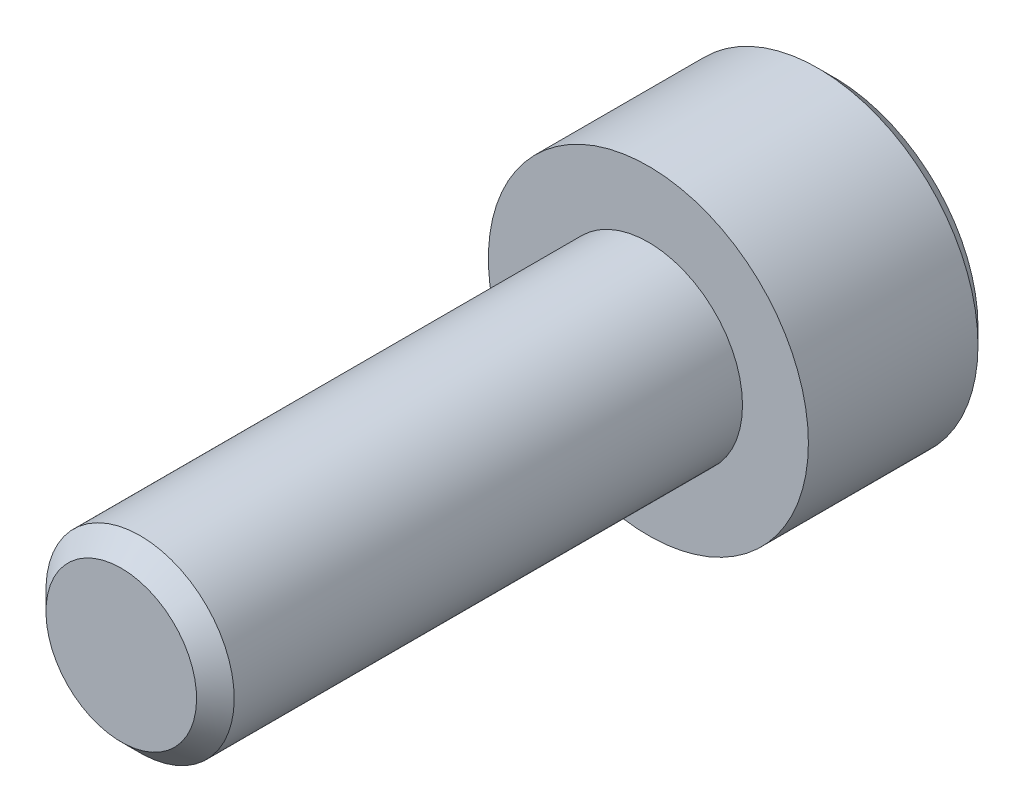
ISO-10303-21;
HEADER;
FILE_DESCRIPTION(('STEP AP214'),'2;1');
FILE_NAME('part.step','',(''),(''),'','','');
FILE_SCHEMA(('AUTOMOTIVE_DESIGN { 1 0 10303 214 1 1 1 1 }'));
ENDSEC;
DATA;
#1=APPLICATION_CONTEXT('core data for automotive mechanical design processes');
#2=APPLICATION_PROTOCOL_DEFINITION('international standard','automotive_design',2000,#1);
#3=PRODUCT_CONTEXT('',#1,'mechanical');
#4=PRODUCT('Part','Part','',(#3));
#5=PRODUCT_RELATED_PRODUCT_CATEGORY('part','',(#4));
#6=PRODUCT_DEFINITION_FORMATION('','',#4);
#7=PRODUCT_DEFINITION_CONTEXT('part definition',#1,'design');
#8=PRODUCT_DEFINITION('design','',#6,#7);
#9=PRODUCT_DEFINITION_SHAPE('','',#8);
#10=(LENGTH_UNIT() NAMED_UNIT(*) SI_UNIT(.MILLI.,.METRE.));
#11=(NAMED_UNIT(*) PLANE_ANGLE_UNIT() SI_UNIT($,.RADIAN.));
#12=(NAMED_UNIT(*) SI_UNIT($,.STERADIAN.) SOLID_ANGLE_UNIT());
#13=UNCERTAINTY_MEASURE_WITH_UNIT(LENGTH_MEASURE(1.E-05),#10,'distance_accuracy_value','');
#14=(GEOMETRIC_REPRESENTATION_CONTEXT(3) GLOBAL_UNCERTAINTY_ASSIGNED_CONTEXT((#13)) GLOBAL_UNIT_ASSIGNED_CONTEXT((#10,
#11,#12)) REPRESENTATION_CONTEXT('',''));
#15=CARTESIAN_POINT('',(0.,0.,0.));
#16=DIRECTION('',(0.,0.,1.));
#17=DIRECTION('',(1.,0.,0.));
#18=AXIS2_PLACEMENT_3D('',#15,#16,#17);
#19=CARTESIAN_POINT('',(0.,0.,-2.43));
#20=DIRECTION('',(0.,0.,1.));
#21=DIRECTION('',(1.,0.,0.));
#22=AXIS2_PLACEMENT_3D('',#19,#20,#21);
#23=PLANE('',#22);
#24=DIRECTION('',(0.,1.,0.));
#25=VECTOR('',#24,1.);
#26=CARTESIAN_POINT('',(2.,1.15470053837925,-2.43));
#27=LINE('',#26,#25);
#28=CARTESIAN_POINT('',(2.,1.15470053837925,-2.43));
#29=VERTEX_POINT('',#28);
#30=CARTESIAN_POINT('',(2.,-1.15470053837925,-2.43));
#31=VERTEX_POINT('',#30);
#32=EDGE_CURVE('E74',#29,#31,#27,.F.);
#33=ORIENTED_EDGE('',*,*,#32,.T.);
#34=DIRECTION('',(0.866025403784439,0.499999999999999,0.));
#35=VECTOR('',#34,1.);
#36=CARTESIAN_POINT('',(2.,-1.15470053837925,-2.43));
#37=LINE('',#36,#35);
#38=CARTESIAN_POINT('',(0.,-2.3094010767585,-2.43));
#39=VERTEX_POINT('',#38);
#40=EDGE_CURVE('E71',#31,#39,#37,.F.);
#41=ORIENTED_EDGE('',*,*,#40,.T.);
#42=DIRECTION('',(0.866025403784438,-0.5,0.));
#43=VECTOR('',#42,1.);
#44=CARTESIAN_POINT('',(0.,-2.3094010767585,-2.43));
#45=LINE('',#44,#43);
#46=CARTESIAN_POINT('',(-2.,-1.15470053837925,-2.43));
#47=VERTEX_POINT('',#46);
#48=EDGE_CURVE('E68',#39,#47,#45,.F.);
#49=ORIENTED_EDGE('',*,*,#48,.T.);
#50=DIRECTION('',(0.,1.,0.));
#51=VECTOR('',#50,1.);
#52=CARTESIAN_POINT('',(-2.,-1.15470053837925,-2.43));
#53=LINE('',#52,#51);
#54=CARTESIAN_POINT('',(-2.,1.15470053837925,-2.43));
#55=VERTEX_POINT('',#54);
#56=EDGE_CURVE('E98',#47,#55,#53,.T.);
#57=ORIENTED_EDGE('',*,*,#56,.T.);
#58=DIRECTION('',(-0.866025403784439,-0.5,0.));
#59=VECTOR('',#58,1.);
#60=CARTESIAN_POINT('',(-2.,1.15470053837925,-2.43));
#61=LINE('',#60,#59);
#62=CARTESIAN_POINT('',(0.,2.3094010767585,-2.43));
#63=VERTEX_POINT('',#62);
#64=EDGE_CURVE('E150',#55,#63,#61,.F.);
#65=ORIENTED_EDGE('',*,*,#64,.T.);
#66=DIRECTION('',(-0.866025403784439,0.5,0.));
#67=VECTOR('',#66,1.);
#68=CARTESIAN_POINT('',(0.,2.3094010767585,-2.43));
#69=LINE('',#68,#67);
#70=EDGE_CURVE('E145',#63,#29,#69,.F.);
#71=ORIENTED_EDGE('',*,*,#70,.T.);
#72=EDGE_LOOP('',(#33,#41,#49,#57,#65,#71));
#73=FACE_BOUND('',#72,.T.);
#74=ADVANCED_FACE('F16',(#73),#23,.F.);
#75=CARTESIAN_POINT('',(2.,-1.15470053837925,-4.93));
#76=DIRECTION('',(0.499999999999999,-0.866025403784439,0.));
#77=DIRECTION('',(0.866025403784439,0.499999999999999,0.));
#78=AXIS2_PLACEMENT_3D('',#75,#76,#77);
#79=PLANE('',#78);
#80=ORIENTED_EDGE('',*,*,#40,.F.);
#81=DIRECTION('',(0.,0.,-1.));
#82=VECTOR('',#81,1.);
#83=CARTESIAN_POINT('',(2.,-1.15470053837925,-4.93));
#84=LINE('',#83,#82);
#85=CARTESIAN_POINT('',(2.,-1.15470053837925,-4.93));
#86=VERTEX_POINT('',#85);
#87=EDGE_CURVE('E137',#31,#86,#84,.T.);
#88=ORIENTED_EDGE('',*,*,#87,.T.);
#89=DIRECTION('',(-0.866025403784439,-0.499999999999999,0.));
#90=VECTOR('',#89,1.);
#91=CARTESIAN_POINT('',(2.,-1.15470053837925,-4.93));
#92=LINE('',#91,#90);
#93=CARTESIAN_POINT('',(0.,-2.3094010767585,-4.93));
#94=VERTEX_POINT('',#93);
#95=EDGE_CURVE('E83',#86,#94,#92,.T.);
#96=ORIENTED_EDGE('',*,*,#95,.T.);
#97=DIRECTION('',(0.,0.,1.));
#98=VECTOR('',#97,1.);
#99=CARTESIAN_POINT('',(0.,-2.3094010767585,-4.93));
#100=LINE('',#99,#98);
#101=EDGE_CURVE('E78',#94,#39,#100,.T.);
#102=ORIENTED_EDGE('',*,*,#101,.T.);
#103=EDGE_LOOP('',(#80,#88,#96,#102));
#104=FACE_BOUND('',#103,.T.);
#105=ADVANCED_FACE('F81',(#104),#79,.F.);
#106=CARTESIAN_POINT('',(0.,-2.3094010767585,-4.93));
#107=DIRECTION('',(-0.5,-0.866025403784438,0.));
#108=DIRECTION('',(0.866025403784438,-0.5,0.));
#109=AXIS2_PLACEMENT_3D('',#106,#107,#108);
#110=PLANE('',#109);
#111=ORIENTED_EDGE('',*,*,#48,.F.);
#112=ORIENTED_EDGE('',*,*,#101,.F.);
#113=DIRECTION('',(-0.866025403784439,0.5,0.));
#114=VECTOR('',#113,1.);
#115=CARTESIAN_POINT('',(0.,-2.3094010767585,-4.93));
#116=LINE('',#115,#114);
#117=CARTESIAN_POINT('',(-2.,-1.15470053837925,-4.93));
#118=VERTEX_POINT('',#117);
#119=EDGE_CURVE('E132',#94,#118,#116,.T.);
#120=ORIENTED_EDGE('',*,*,#119,.T.);
#121=DIRECTION('',(0.,0.,1.));
#122=VECTOR('',#121,1.);
#123=CARTESIAN_POINT('',(-2.,-1.15470053837925,-4.93));
#124=LINE('',#123,#122);
#125=EDGE_CURVE('E90',#118,#47,#124,.T.);
#126=ORIENTED_EDGE('',*,*,#125,.T.);
#127=EDGE_LOOP('',(#111,#112,#120,#126));
#128=FACE_BOUND('',#127,.T.);
#129=ADVANCED_FACE('F88',(#128),#110,.F.);
#130=CARTESIAN_POINT('',(-2.,-1.15470053837925,-4.93));
#131=DIRECTION('',(-1.,0.,0.));
#132=DIRECTION('',(0.,0.,1.));
#133=AXIS2_PLACEMENT_3D('',#130,#131,#132);
#134=PLANE('',#133);
#135=ORIENTED_EDGE('',*,*,#56,.F.);
#136=ORIENTED_EDGE('',*,*,#125,.F.);
#137=DIRECTION('',(0.,1.,0.));
#138=VECTOR('',#137,1.);
#139=CARTESIAN_POINT('',(-2.,0.,-4.93));
#140=LINE('',#139,#138);
#141=CARTESIAN_POINT('',(-2.,1.15470053837925,-4.93));
#142=VERTEX_POINT('',#141);
#143=EDGE_CURVE('E130',#118,#142,#140,.T.);
#144=ORIENTED_EDGE('',*,*,#143,.T.);
#145=DIRECTION('',(0.,0.,1.));
#146=VECTOR('',#145,1.);
#147=CARTESIAN_POINT('',(-2.,1.15470053837925,-4.93));
#148=LINE('',#147,#146);
#149=EDGE_CURVE('E153',#142,#55,#148,.T.);
#150=ORIENTED_EDGE('',*,*,#149,.T.);
#151=EDGE_LOOP('',(#135,#136,#144,#150));
#152=FACE_BOUND('',#151,.T.);
#153=ADVANCED_FACE('F160',(#152),#134,.F.);
#154=CARTESIAN_POINT('',(-2.,1.15470053837925,-4.93));
#155=DIRECTION('',(-0.5,0.866025403784439,0.));
#156=DIRECTION('',(-0.866025403784439,-0.5,0.));
#157=AXIS2_PLACEMENT_3D('',#154,#155,#156);
#158=PLANE('',#157);
#159=ORIENTED_EDGE('',*,*,#64,.F.);
#160=ORIENTED_EDGE('',*,*,#149,.F.);
#161=DIRECTION('',(0.866025403784439,0.499999999999999,0.));
#162=VECTOR('',#161,1.);
#163=CARTESIAN_POINT('',(-2.,1.15470053837925,-4.93));
#164=LINE('',#163,#162);
#165=CARTESIAN_POINT('',(0.,2.3094010767585,-4.93));
#166=VERTEX_POINT('',#165);
#167=EDGE_CURVE('E127',#142,#166,#164,.T.);
#168=ORIENTED_EDGE('',*,*,#167,.T.);
#169=DIRECTION('',(0.,0.,1.));
#170=VECTOR('',#169,1.);
#171=CARTESIAN_POINT('',(0.,2.3094010767585,-4.93));
#172=LINE('',#171,#170);
#173=EDGE_CURVE('E147',#166,#63,#172,.T.);
#174=ORIENTED_EDGE('',*,*,#173,.T.);
#175=EDGE_LOOP('',(#159,#160,#168,#174));
#176=FACE_BOUND('',#175,.T.);
#177=ADVANCED_FACE('F164',(#176),#158,.F.);
#178=CARTESIAN_POINT('',(0.,2.3094010767585,-4.93));
#179=DIRECTION('',(0.5,0.866025403784439,0.));
#180=DIRECTION('',(-0.866025403784439,0.5,0.));
#181=AXIS2_PLACEMENT_3D('',#178,#179,#180);
#182=PLANE('',#181);
#183=ORIENTED_EDGE('',*,*,#70,.F.);
#184=ORIENTED_EDGE('',*,*,#173,.F.);
#185=DIRECTION('',(0.866025403784439,-0.5,0.));
#186=VECTOR('',#185,1.);
#187=CARTESIAN_POINT('',(0.,2.3094010767585,-4.93));
#188=LINE('',#187,#186);
#189=CARTESIAN_POINT('',(2.,1.15470053837925,-4.93));
#190=VERTEX_POINT('',#189);
#191=EDGE_CURVE('E35',#166,#190,#188,.T.);
#192=ORIENTED_EDGE('',*,*,#191,.T.);
#193=DIRECTION('',(0.,0.,-1.));
#194=VECTOR('',#193,1.);
#195=CARTESIAN_POINT('',(2.,1.15470053837925,-4.93));
#196=LINE('',#195,#194);
#197=EDGE_CURVE('E142',#190,#29,#196,.F.);
#198=ORIENTED_EDGE('',*,*,#197,.T.);
#199=EDGE_LOOP('',(#183,#184,#192,#198));
#200=FACE_BOUND('',#199,.T.);
#201=ADVANCED_FACE('F166',(#200),#182,.F.);
#202=CARTESIAN_POINT('',(2.,1.15470053837925,-4.93));
#203=DIRECTION('',(1.,0.,0.));
#204=DIRECTION('',(0.,0.,-1.));
#205=AXIS2_PLACEMENT_3D('',#202,#203,#204);
#206=PLANE('',#205);
#207=ORIENTED_EDGE('',*,*,#32,.F.);
#208=ORIENTED_EDGE('',*,*,#197,.F.);
#209=DIRECTION('',(0.,1.,0.));
#210=VECTOR('',#209,1.);
#211=CARTESIAN_POINT('',(2.,0.,-4.93));
#212=LINE('',#211,#210);
#213=EDGE_CURVE('E121',#190,#86,#212,.F.);
#214=ORIENTED_EDGE('',*,*,#213,.T.);
#215=ORIENTED_EDGE('',*,*,#87,.F.);
#216=EDGE_LOOP('',(#207,#208,#214,#215));
#217=FACE_BOUND('',#216,.T.);
#218=ADVANCED_FACE('F169',(#217),#206,.F.);
#219=CARTESIAN_POINT('',(0.,0.,-4.93));
#220=DIRECTION('',(0.,0.,1.));
#221=DIRECTION('',(1.,0.,0.));
#222=AXIS2_PLACEMENT_3D('',#219,#220,#221);
#223=PLANE('',#222);
#224=ORIENTED_EDGE('',*,*,#191,.F.);
#225=ORIENTED_EDGE('',*,*,#167,.F.);
#226=ORIENTED_EDGE('',*,*,#143,.F.);
#227=ORIENTED_EDGE('',*,*,#119,.F.);
#228=ORIENTED_EDGE('',*,*,#95,.F.);
#229=ORIENTED_EDGE('',*,*,#213,.F.);
#230=EDGE_LOOP('',(#224,#225,#226,#227,#228,#229));
#231=FACE_BOUND('',#230,.T.);
#232=CARTESIAN_POINT('',(0.,0.,-4.9300000000585));
#233=DIRECTION('',(0.,0.,1.));
#234=DIRECTION('',(1.,0.,0.));
#235=AXIS2_PLACEMENT_3D('',#232,#233,#234);
#236=CIRCLE('',#235,3.82500000000618);
#237=CARTESIAN_POINT('',(3.82500000000618,0.,-4.9300000000585));
#238=VERTEX_POINT('',#237);
#239=EDGE_CURVE('E19',#238,#238,#236,.T.);
#240=ORIENTED_EDGE('',*,*,#239,.F.);
#241=EDGE_LOOP('',(#240));
#242=FACE_BOUND('',#241,.T.);
#243=ADVANCED_FACE('F171',(#231,#242),#223,.F.);
#244=CARTESIAN_POINT('',(0.,0.,-4.50499999999465));
#245=DIRECTION('',(0.,0.,1.));
#246=DIRECTION('',(1.,0.,0.));
#247=AXIS2_PLACEMENT_3D('',#244,#245,#246);
#248=CONICAL_SURFACE('',#247,4.25000000007003,0.785398163397448);
#249=ORIENTED_EDGE('',*,*,#239,.T.);
#250=EDGE_LOOP('',(#249));
#251=FACE_BOUND('',#250,.T.);
#252=CARTESIAN_POINT('',(0.,0.,-4.505));
#253=DIRECTION('',(0.,0.,1.));
#254=DIRECTION('',(1.,0.,0.));
#255=AXIS2_PLACEMENT_3D('',#252,#253,#254);
#256=CIRCLE('',#255,4.25);
#257=CARTESIAN_POINT('',(4.25,0.,-4.505));
#258=VERTEX_POINT('',#257);
#259=EDGE_CURVE('E108',#258,#258,#256,.T.);
#260=ORIENTED_EDGE('',*,*,#259,.F.);
#261=EDGE_LOOP('',(#260));
#262=FACE_BOUND('',#261,.T.);
#263=ADVANCED_FACE('F174',(#251,#262),#248,.T.);
#264=CARTESIAN_POINT('',(0.,0.,14.));
#265=DIRECTION('',(0.,0.,1.));
#266=DIRECTION('',(1.,0.,0.));
#267=AXIS2_PLACEMENT_3D('',#264,#265,#266);
#268=PLANE('',#267);
#269=CARTESIAN_POINT('',(0.,0.,14.0000000000668));
#270=DIRECTION('',(0.,0.,-1.));
#271=DIRECTION('',(0.,1.,0.));
#272=AXIS2_PLACEMENT_3D('',#269,#270,#271);
#273=CIRCLE('',#272,1.99999999995271);
#274=CARTESIAN_POINT('',(0.,1.99999999995271,14.0000000000668));
#275=VERTEX_POINT('',#274);
#276=EDGE_CURVE('E105',#275,#275,#273,.T.);
#277=ORIENTED_EDGE('',*,*,#276,.F.);
#278=EDGE_LOOP('',(#277));
#279=FACE_BOUND('',#278,.T.);
#280=ADVANCED_FACE('F180',(#279),#268,.T.);
#281=CARTESIAN_POINT('',(0.,0.,-4.93));
#282=DIRECTION('',(0.,0.,1.));
#283=DIRECTION('',(1.,0.,0.));
#284=AXIS2_PLACEMENT_3D('',#281,#282,#283);
#285=CYLINDRICAL_SURFACE('',#284,4.25);
#286=ORIENTED_EDGE('',*,*,#259,.T.);
#287=EDGE_LOOP('',(#286));
#288=FACE_BOUND('',#287,.T.);
#289=CARTESIAN_POINT('',(0.,0.,0.));
#290=DIRECTION('',(0.,0.,1.));
#291=DIRECTION('',(1.,0.,0.));
#292=AXIS2_PLACEMENT_3D('',#289,#290,#291);
#293=CIRCLE('',#292,4.25);
#294=CARTESIAN_POINT('',(4.25,0.,0.));
#295=VERTEX_POINT('',#294);
#296=EDGE_CURVE('E102',#295,#295,#293,.T.);
#297=ORIENTED_EDGE('',*,*,#296,.F.);
#298=EDGE_LOOP('',(#297));
#299=FACE_BOUND('',#298,.T.);
#300=ADVANCED_FACE('F185',(#288,#299),#285,.T.);
#301=CARTESIAN_POINT('',(0.,0.,13.5000000001355));
#302=DIRECTION('',(0.,0.,-1.));
#303=DIRECTION('',(0.,1.,0.));
#304=AXIS2_PLACEMENT_3D('',#301,#302,#303);
#305=CONICAL_SURFACE('',#304,2.49999999988404,0.785398163397448);
#306=CARTESIAN_POINT('',(0.,0.,13.5));
#307=DIRECTION('',(0.,0.,1.));
#308=DIRECTION('',(1.,0.,0.));
#309=AXIS2_PLACEMENT_3D('',#306,#307,#308);
#310=CIRCLE('',#309,2.5);
#311=CARTESIAN_POINT('',(2.5,0.,13.5));
#312=VERTEX_POINT('',#311);
#313=EDGE_CURVE('E26',#312,#312,#310,.F.);
#314=ORIENTED_EDGE('',*,*,#313,.F.);
#315=EDGE_LOOP('',(#314));
#316=FACE_BOUND('',#315,.T.);
#317=ORIENTED_EDGE('',*,*,#276,.T.);
#318=EDGE_LOOP('',(#317));
#319=FACE_BOUND('',#318,.T.);
#320=ADVANCED_FACE('F195',(#316,#319),#305,.T.);
#321=CARTESIAN_POINT('',(0.,0.,0.));
#322=DIRECTION('',(0.,0.,1.));
#323=DIRECTION('',(1.,0.,0.));
#324=AXIS2_PLACEMENT_3D('',#321,#322,#323);
#325=PLANE('',#324);
#326=CARTESIAN_POINT('',(0.,0.,0.));
#327=DIRECTION('',(0.,0.,1.));
#328=DIRECTION('',(1.,0.,0.));
#329=AXIS2_PLACEMENT_3D('',#326,#327,#328);
#330=CIRCLE('',#329,2.5);
#331=CARTESIAN_POINT('',(2.5,0.,0.));
#332=VERTEX_POINT('',#331);
#333=EDGE_CURVE('E11',#332,#332,#330,.T.);
#334=ORIENTED_EDGE('',*,*,#333,.F.);
#335=EDGE_LOOP('',(#334));
#336=FACE_BOUND('',#335,.T.);
#337=ORIENTED_EDGE('',*,*,#296,.T.);
#338=EDGE_LOOP('',(#337));
#339=FACE_BOUND('',#338,.T.);
#340=ADVANCED_FACE('F190',(#336,#339),#325,.T.);
#341=CARTESIAN_POINT('',(0.,0.,0.));
#342=DIRECTION('',(0.,0.,1.));
#343=DIRECTION('',(1.,0.,0.));
#344=AXIS2_PLACEMENT_3D('',#341,#342,#343);
#345=CYLINDRICAL_SURFACE('',#344,2.5);
#346=ORIENTED_EDGE('',*,*,#333,.T.);
#347=EDGE_LOOP('',(#346));
#348=FACE_BOUND('',#347,.T.);
#349=ORIENTED_EDGE('',*,*,#313,.T.);
#350=EDGE_LOOP('',(#349));
#351=FACE_BOUND('',#350,.T.);
#352=ADVANCED_FACE('F188',(#348,#351),#345,.T.);
#353=CLOSED_SHELL('',(#74,#105,#129,#153,#177,#201,#218,#243,#263,#280,#300,#320,#340,#352));
#354=MANIFOLD_SOLID_BREP('B1',#353);
#355=ADVANCED_BREP_SHAPE_REPRESENTATION('',(#18,#354),#14);
#356=SHAPE_DEFINITION_REPRESENTATION(#9,#355);
ENDSEC;
END-ISO-10303-21;
